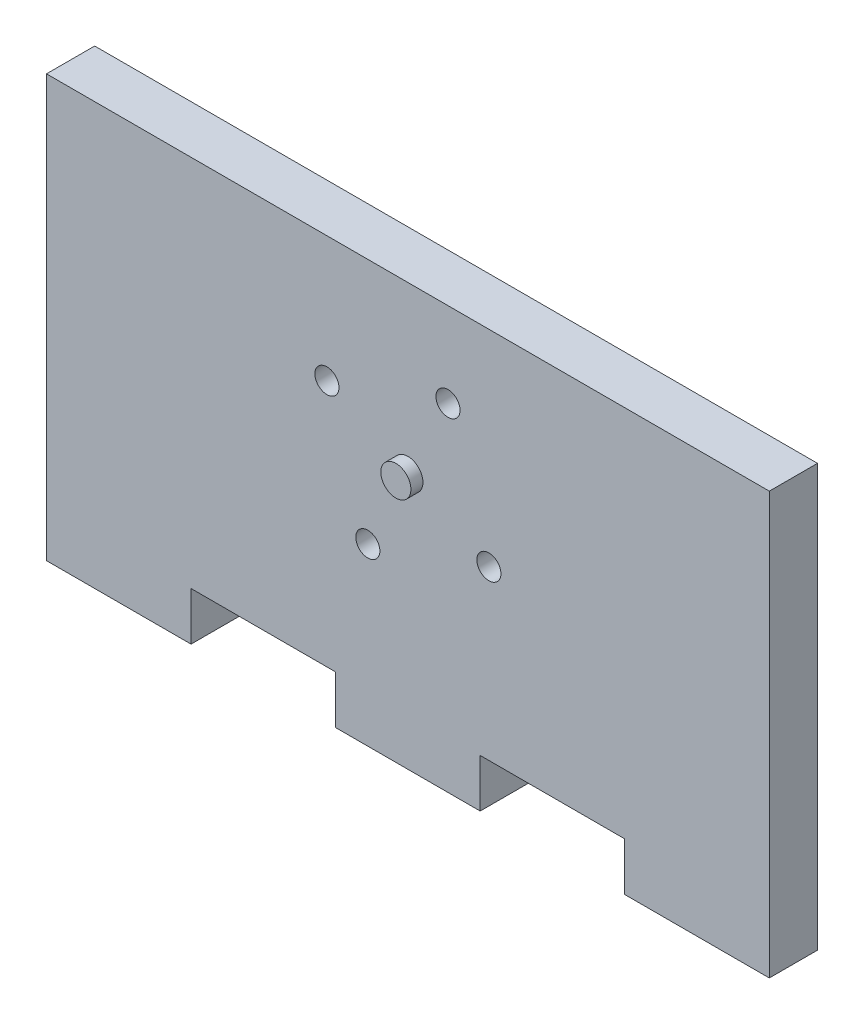
ISO-10303-21;
HEADER;
FILE_DESCRIPTION(('STEP AP214'),'2;1');
FILE_NAME('part.step','',(''),(''),'','','');
FILE_SCHEMA(('AUTOMOTIVE_DESIGN { 1 0 10303 214 1 1 1 1 }'));
ENDSEC;
DATA;
#1=APPLICATION_CONTEXT('core data for automotive mechanical design processes');
#2=APPLICATION_PROTOCOL_DEFINITION('international standard','automotive_design',2000,#1);
#3=PRODUCT_CONTEXT('',#1,'mechanical');
#4=PRODUCT('Part','Part','',(#3));
#5=PRODUCT_RELATED_PRODUCT_CATEGORY('part','',(#4));
#6=PRODUCT_DEFINITION_FORMATION('','',#4);
#7=PRODUCT_DEFINITION_CONTEXT('part definition',#1,'design');
#8=PRODUCT_DEFINITION('design','',#6,#7);
#9=PRODUCT_DEFINITION_SHAPE('','',#8);
#10=(LENGTH_UNIT() NAMED_UNIT(*) SI_UNIT(.MILLI.,.METRE.));
#11=(NAMED_UNIT(*) PLANE_ANGLE_UNIT() SI_UNIT($,.RADIAN.));
#12=(NAMED_UNIT(*) SI_UNIT($,.STERADIAN.) SOLID_ANGLE_UNIT());
#13=UNCERTAINTY_MEASURE_WITH_UNIT(LENGTH_MEASURE(1.E-05),#10,'distance_accuracy_value','');
#14=(GEOMETRIC_REPRESENTATION_CONTEXT(3) GLOBAL_UNCERTAINTY_ASSIGNED_CONTEXT((#13)) GLOBAL_UNIT_ASSIGNED_CONTEXT((#10,
#11,#12)) REPRESENTATION_CONTEXT('',''));
#15=CARTESIAN_POINT('',(0.,0.,0.));
#16=DIRECTION('',(0.,0.,1.));
#17=DIRECTION('',(1.,0.,0.));
#18=AXIS2_PLACEMENT_3D('',#15,#16,#17);
#19=CARTESIAN_POINT('',(38.1,-22.225,5.08));
#20=DIRECTION('',(0.,1.,0.));
#21=DIRECTION('',(-1.,0.,0.));
#22=AXIS2_PLACEMENT_3D('',#19,#20,#21);
#23=PLANE('',#22);
#24=DIRECTION('',(1.,0.,0.));
#25=VECTOR('',#24,1.);
#26=CARTESIAN_POINT('',(38.1,-22.225,0.));
#27=LINE('',#26,#25);
#28=CARTESIAN_POINT('',(-38.1,-22.225,0.));
#29=VERTEX_POINT('',#28);
#30=CARTESIAN_POINT('',(-22.86,-22.225,0.));
#31=VERTEX_POINT('',#30);
#32=EDGE_CURVE('E220',#29,#31,#27,.T.);
#33=ORIENTED_EDGE('',*,*,#32,.T.);
#34=DIRECTION('',(0.,0.,-1.));
#35=VECTOR('',#34,1.);
#36=CARTESIAN_POINT('',(-22.86,-22.225,0.));
#37=LINE('',#36,#35);
#38=CARTESIAN_POINT('',(-22.86,-22.225,5.08));
#39=VERTEX_POINT('',#38);
#40=EDGE_CURVE('E168',#39,#31,#37,.T.);
#41=ORIENTED_EDGE('',*,*,#40,.F.);
#42=DIRECTION('',(1.,0.,0.));
#43=VECTOR('',#42,1.);
#44=CARTESIAN_POINT('',(38.1,-22.225,5.08));
#45=LINE('',#44,#43);
#46=CARTESIAN_POINT('',(-38.1,-22.225,5.08));
#47=VERTEX_POINT('',#46);
#48=EDGE_CURVE('E208',#47,#39,#45,.T.);
#49=ORIENTED_EDGE('',*,*,#48,.F.);
#50=DIRECTION('',(0.,0.,-1.));
#51=VECTOR('',#50,1.);
#52=CARTESIAN_POINT('',(-38.1,-22.225,5.08));
#53=LINE('',#52,#51);
#54=EDGE_CURVE('E37',#47,#29,#53,.T.);
#55=ORIENTED_EDGE('',*,*,#54,.T.);
#56=EDGE_LOOP('',(#33,#41,#49,#55));
#57=FACE_BOUND('',#56,.T.);
#58=ADVANCED_FACE('F33',(#57),#23,.F.);
#59=CARTESIAN_POINT('',(22.86,-22.225,5.08));
#60=VERTEX_POINT('',#59);
#61=CARTESIAN_POINT('',(38.1,-22.225,5.08));
#62=VERTEX_POINT('',#61);
#63=EDGE_CURVE('E206',#60,#62,#45,.T.);
#64=ORIENTED_EDGE('',*,*,#63,.F.);
#65=DIRECTION('',(0.,0.,1.));
#66=VECTOR('',#65,1.);
#67=CARTESIAN_POINT('',(22.86,-22.225,5.08));
#68=LINE('',#67,#66);
#69=CARTESIAN_POINT('',(22.86,-22.225,0.));
#70=VERTEX_POINT('',#69);
#71=EDGE_CURVE('E163',#70,#60,#68,.T.);
#72=ORIENTED_EDGE('',*,*,#71,.F.);
#73=CARTESIAN_POINT('',(38.1,-22.225,0.));
#74=VERTEX_POINT('',#73);
#75=EDGE_CURVE('E219',#70,#74,#27,.T.);
#76=ORIENTED_EDGE('',*,*,#75,.T.);
#77=DIRECTION('',(0.,0.,-1.));
#78=VECTOR('',#77,1.);
#79=CARTESIAN_POINT('',(38.1,-22.225,5.08));
#80=LINE('',#79,#78);
#81=EDGE_CURVE('E230',#62,#74,#80,.T.);
#82=ORIENTED_EDGE('',*,*,#81,.F.);
#83=EDGE_LOOP('',(#64,#72,#76,#82));
#84=FACE_BOUND('',#83,.T.);
#85=ADVANCED_FACE('F274',(#84),#23,.F.);
#86=CARTESIAN_POINT('',(-38.1,-22.225,5.08));
#87=DIRECTION('',(1.,0.,0.));
#88=DIRECTION('',(0.,0.,-1.));
#89=AXIS2_PLACEMENT_3D('',#86,#87,#88);
#90=PLANE('',#89);
#91=DIRECTION('',(0.,-1.,0.));
#92=VECTOR('',#91,1.);
#93=CARTESIAN_POINT('',(-38.1,-22.225,0.));
#94=LINE('',#93,#92);
#95=CARTESIAN_POINT('',(-38.1,22.225,0.));
#96=VERTEX_POINT('',#95);
#97=EDGE_CURVE('E201',#96,#29,#94,.T.);
#98=ORIENTED_EDGE('',*,*,#97,.T.);
#99=ORIENTED_EDGE('',*,*,#54,.F.);
#100=DIRECTION('',(0.,-1.,0.));
#101=VECTOR('',#100,1.);
#102=CARTESIAN_POINT('',(-38.1,-22.225,5.08));
#103=LINE('',#102,#101);
#104=CARTESIAN_POINT('',(-38.1,22.225,5.08));
#105=VERTEX_POINT('',#104);
#106=EDGE_CURVE('E203',#105,#47,#103,.T.);
#107=ORIENTED_EDGE('',*,*,#106,.F.);
#108=DIRECTION('',(0.,0.,-1.));
#109=VECTOR('',#108,1.);
#110=CARTESIAN_POINT('',(-38.1,22.225,5.08));
#111=LINE('',#110,#109);
#112=EDGE_CURVE('E216',#105,#96,#111,.T.);
#113=ORIENTED_EDGE('',*,*,#112,.T.);
#114=EDGE_LOOP('',(#98,#99,#107,#113));
#115=FACE_BOUND('',#114,.T.);
#116=ADVANCED_FACE('F35',(#115),#90,.F.);
#117=CARTESIAN_POINT('',(-7.61999999999998,-22.225,5.08));
#118=VERTEX_POINT('',#117);
#119=CARTESIAN_POINT('',(7.62000000000002,-22.225,5.08));
#120=VERTEX_POINT('',#119);
#121=EDGE_CURVE('E212',#118,#120,#45,.T.);
#122=ORIENTED_EDGE('',*,*,#121,.F.);
#123=DIRECTION('',(0.,0.,1.));
#124=VECTOR('',#123,1.);
#125=CARTESIAN_POINT('',(-7.61999999999998,-22.225,0.));
#126=LINE('',#125,#124);
#127=CARTESIAN_POINT('',(-7.61999999999998,-22.225,0.));
#128=VERTEX_POINT('',#127);
#129=EDGE_CURVE('E248',#128,#118,#126,.T.);
#130=ORIENTED_EDGE('',*,*,#129,.F.);
#131=CARTESIAN_POINT('',(7.62000000000002,-22.225,0.));
#132=VERTEX_POINT('',#131);
#133=EDGE_CURVE('E145',#128,#132,#27,.T.);
#134=ORIENTED_EDGE('',*,*,#133,.T.);
#135=DIRECTION('',(0.,0.,-1.));
#136=VECTOR('',#135,1.);
#137=CARTESIAN_POINT('',(7.62000000000002,-22.225,5.08));
#138=LINE('',#137,#136);
#139=EDGE_CURVE('E157',#120,#132,#138,.T.);
#140=ORIENTED_EDGE('',*,*,#139,.F.);
#141=EDGE_LOOP('',(#122,#130,#134,#140));
#142=FACE_BOUND('',#141,.T.);
#143=ADVANCED_FACE('F269',(#142),#23,.F.);
#144=CARTESIAN_POINT('',(38.1,-22.225,5.08));
#145=DIRECTION('',(-1.,0.,0.));
#146=DIRECTION('',(0.,0.,1.));
#147=AXIS2_PLACEMENT_3D('',#144,#145,#146);
#148=PLANE('',#147);
#149=DIRECTION('',(0.,1.,0.));
#150=VECTOR('',#149,1.);
#151=CARTESIAN_POINT('',(38.1,-22.225,0.));
#152=LINE('',#151,#150);
#153=CARTESIAN_POINT('',(38.1,22.225,0.));
#154=VERTEX_POINT('',#153);
#155=EDGE_CURVE('E223',#74,#154,#152,.T.);
#156=ORIENTED_EDGE('',*,*,#155,.T.);
#157=DIRECTION('',(0.,0.,-1.));
#158=VECTOR('',#157,1.);
#159=CARTESIAN_POINT('',(38.1,22.225,5.08));
#160=LINE('',#159,#158);
#161=CARTESIAN_POINT('',(38.1,22.225,5.08));
#162=VERTEX_POINT('',#161);
#163=EDGE_CURVE('E228',#162,#154,#160,.T.);
#164=ORIENTED_EDGE('',*,*,#163,.F.);
#165=DIRECTION('',(0.,1.,0.));
#166=VECTOR('',#165,1.);
#167=CARTESIAN_POINT('',(38.1,-22.225,5.08));
#168=LINE('',#167,#166);
#169=EDGE_CURVE('E211',#62,#162,#168,.T.);
#170=ORIENTED_EDGE('',*,*,#169,.F.);
#171=ORIENTED_EDGE('',*,*,#81,.T.);
#172=EDGE_LOOP('',(#156,#164,#170,#171));
#173=FACE_BOUND('',#172,.T.);
#174=ADVANCED_FACE('F260',(#173),#148,.F.);
#175=CARTESIAN_POINT('',(38.1,22.225,5.08));
#176=DIRECTION('',(0.,-1.,0.));
#177=DIRECTION('',(1.,0.,0.));
#178=AXIS2_PLACEMENT_3D('',#175,#176,#177);
#179=PLANE('',#178);
#180=DIRECTION('',(-1.,0.,0.));
#181=VECTOR('',#180,1.);
#182=CARTESIAN_POINT('',(38.1,22.225,0.));
#183=LINE('',#182,#181);
#184=EDGE_CURVE('E207',#154,#96,#183,.T.);
#185=ORIENTED_EDGE('',*,*,#184,.T.);
#186=ORIENTED_EDGE('',*,*,#112,.F.);
#187=DIRECTION('',(-1.,0.,0.));
#188=VECTOR('',#187,1.);
#189=CARTESIAN_POINT('',(38.1,22.225,5.08));
#190=LINE('',#189,#188);
#191=EDGE_CURVE('E214',#162,#105,#190,.T.);
#192=ORIENTED_EDGE('',*,*,#191,.F.);
#193=ORIENTED_EDGE('',*,*,#163,.T.);
#194=EDGE_LOOP('',(#185,#186,#192,#193));
#195=FACE_BOUND('',#194,.T.);
#196=ADVANCED_FACE('F259',(#195),#179,.F.);
#197=CARTESIAN_POINT('',(0.,0.,5.08));
#198=DIRECTION('',(0.,0.,1.));
#199=DIRECTION('',(1.,0.,0.));
#200=AXIS2_PLACEMENT_3D('',#197,#198,#199);
#201=PLANE('',#200);
#202=DIRECTION('',(0.,-1.,0.));
#203=VECTOR('',#202,1.);
#204=CARTESIAN_POINT('',(-22.86,-17.145,5.08));
#205=LINE('',#204,#203);
#206=CARTESIAN_POINT('',(-22.86,-17.145,5.08));
#207=VERTEX_POINT('',#206);
#208=EDGE_CURVE('E148',#207,#39,#205,.T.);
#209=ORIENTED_EDGE('',*,*,#208,.F.);
#210=DIRECTION('',(-1.,0.,0.));
#211=VECTOR('',#210,1.);
#212=CARTESIAN_POINT('',(-22.86,-17.145,5.08));
#213=LINE('',#212,#211);
#214=CARTESIAN_POINT('',(-7.61999999999998,-17.145,5.08));
#215=VERTEX_POINT('',#214);
#216=EDGE_CURVE('E132',#215,#207,#213,.T.);
#217=ORIENTED_EDGE('',*,*,#216,.F.);
#218=DIRECTION('',(0.,-1.,0.));
#219=VECTOR('',#218,1.);
#220=CARTESIAN_POINT('',(-7.61999999999998,-17.145,5.08));
#221=LINE('',#220,#219);
#222=EDGE_CURVE('E130',#215,#118,#221,.T.);
#223=ORIENTED_EDGE('',*,*,#222,.T.);
#224=ORIENTED_EDGE('',*,*,#121,.T.);
#225=DIRECTION('',(0.,-1.,0.));
#226=VECTOR('',#225,1.);
#227=CARTESIAN_POINT('',(7.62000000000002,-17.145,5.08));
#228=LINE('',#227,#226);
#229=CARTESIAN_POINT('',(7.62000000000002,-17.145,5.08));
#230=VERTEX_POINT('',#229);
#231=EDGE_CURVE('E171',#230,#120,#228,.T.);
#232=ORIENTED_EDGE('',*,*,#231,.F.);
#233=DIRECTION('',(-1.,0.,0.));
#234=VECTOR('',#233,1.);
#235=CARTESIAN_POINT('',(7.62000000000002,-17.145,5.08));
#236=LINE('',#235,#234);
#237=CARTESIAN_POINT('',(22.86,-17.145,5.08));
#238=VERTEX_POINT('',#237);
#239=EDGE_CURVE('E156',#238,#230,#236,.T.);
#240=ORIENTED_EDGE('',*,*,#239,.F.);
#241=DIRECTION('',(0.,-1.,0.));
#242=VECTOR('',#241,1.);
#243=CARTESIAN_POINT('',(22.86,-17.145,5.08));
#244=LINE('',#243,#242);
#245=EDGE_CURVE('E162',#238,#60,#244,.T.);
#246=ORIENTED_EDGE('',*,*,#245,.T.);
#247=ORIENTED_EDGE('',*,*,#63,.T.);
#248=ORIENTED_EDGE('',*,*,#169,.T.);
#249=ORIENTED_EDGE('',*,*,#191,.T.);
#250=ORIENTED_EDGE('',*,*,#106,.T.);
#251=ORIENTED_EDGE('',*,*,#48,.T.);
#252=EDGE_LOOP('',(#209,#217,#223,#224,#232,#240,#246,#247,#248,#249,#250,#251));
#253=FACE_BOUND('',#252,.T.);
#254=CARTESIAN_POINT('',(-4.22601314755713,-3.7736840348773,5.08));
#255=DIRECTION('',(0.,0.,1.));
#256=DIRECTION('',(1.,0.,0.));
#257=AXIS2_PLACEMENT_3D('',#254,#255,#256);
#258=CIRCLE('',#257,1.26999999992882);
#259=CARTESIAN_POINT('',(-2.95601314762831,-3.7736840348773,5.08));
#260=VERTEX_POINT('',#259);
#261=EDGE_CURVE('E196',#260,#260,#258,.T.);
#262=ORIENTED_EDGE('',*,*,#261,.F.);
#263=EDGE_LOOP('',(#262));
#264=FACE_BOUND('',#263,.T.);
#265=CARTESIAN_POINT('',(8.53618403481198,0.536486852491764,5.08));
#266=DIRECTION('',(0.,0.,1.));
#267=DIRECTION('',(1.,0.,0.));
#268=AXIS2_PLACEMENT_3D('',#265,#266,#267);
#269=CIRCLE('',#268,1.26999999994442);
#270=CARTESIAN_POINT('',(9.8061840347564,0.536486852491764,5.08));
#271=VERTEX_POINT('',#270);
#272=EDGE_CURVE('E193',#271,#271,#269,.T.);
#273=ORIENTED_EDGE('',*,*,#272,.F.);
#274=EDGE_LOOP('',(#273));
#275=FACE_BOUND('',#274,.T.);
#276=CARTESIAN_POINT('',(4.22601314744267,13.2986840348611,5.08));
#277=DIRECTION('',(0.,0.,1.));
#278=DIRECTION('',(1.,0.,0.));
#279=AXIS2_PLACEMENT_3D('',#276,#277,#278);
#280=CIRCLE('',#279,1.26999999996631);
#281=CARTESIAN_POINT('',(5.49601314740899,13.2986840348611,5.08));
#282=VERTEX_POINT('',#281);
#283=EDGE_CURVE('E190',#282,#282,#280,.T.);
#284=ORIENTED_EDGE('',*,*,#283,.F.);
#285=EDGE_LOOP('',(#284));
#286=FACE_BOUND('',#285,.T.);
#287=CARTESIAN_POINT('',(-8.53618403492646,8.98851314749197,5.08));
#288=DIRECTION('',(0.,0.,1.));
#289=DIRECTION('',(1.,0.,0.));
#290=AXIS2_PLACEMENT_3D('',#287,#288,#289);
#291=CIRCLE('',#290,1.26999999995079);
#292=CARTESIAN_POINT('',(-7.26618403497567,8.98851314749197,5.08));
#293=VERTEX_POINT('',#292);
#294=EDGE_CURVE('E178',#293,#293,#291,.T.);
#295=ORIENTED_EDGE('',*,*,#294,.F.);
#296=EDGE_LOOP('',(#295));
#297=FACE_BOUND('',#296,.T.);
#298=CARTESIAN_POINT('',(-5.74262859487362E-11,4.76249999999212,5.08));
#299=DIRECTION('',(0.,0.,1.));
#300=DIRECTION('',(1.,0.,0.));
#301=AXIS2_PLACEMENT_3D('',#298,#299,#300);
#302=CIRCLE('',#301,1.58749999994738);
#303=CARTESIAN_POINT('',(1.58749999988995,4.76249999999212,5.08));
#304=VERTEX_POINT('',#303);
#305=EDGE_CURVE('E11',#304,#304,#302,.T.);
#306=ORIENTED_EDGE('',*,*,#305,.F.);
#307=EDGE_LOOP('',(#306));
#308=FACE_BOUND('',#307,.T.);
#309=ADVANCED_FACE('F254',(#253,#264,#275,#286,#297,#308),#201,.T.);
#310=CARTESIAN_POINT('',(0.,0.,0.));
#311=DIRECTION('',(0.,0.,1.));
#312=DIRECTION('',(1.,0.,0.));
#313=AXIS2_PLACEMENT_3D('',#310,#311,#312);
#314=PLANE('',#313);
#315=DIRECTION('',(1.,0.,0.));
#316=VECTOR('',#315,1.);
#317=CARTESIAN_POINT('',(-22.86,-17.145,0.));
#318=LINE('',#317,#316);
#319=CARTESIAN_POINT('',(-22.86,-17.145,0.));
#320=VERTEX_POINT('',#319);
#321=CARTESIAN_POINT('',(-7.61999999999998,-17.145,0.));
#322=VERTEX_POINT('',#321);
#323=EDGE_CURVE('E133',#320,#322,#318,.T.);
#324=ORIENTED_EDGE('',*,*,#323,.F.);
#325=DIRECTION('',(0.,-1.,0.));
#326=VECTOR('',#325,1.);
#327=CARTESIAN_POINT('',(-22.86,-17.145,0.));
#328=LINE('',#327,#326);
#329=EDGE_CURVE('E146',#320,#31,#328,.T.);
#330=ORIENTED_EDGE('',*,*,#329,.T.);
#331=ORIENTED_EDGE('',*,*,#32,.F.);
#332=ORIENTED_EDGE('',*,*,#97,.F.);
#333=ORIENTED_EDGE('',*,*,#184,.F.);
#334=ORIENTED_EDGE('',*,*,#155,.F.);
#335=ORIENTED_EDGE('',*,*,#75,.F.);
#336=DIRECTION('',(0.,-1.,0.));
#337=VECTOR('',#336,1.);
#338=CARTESIAN_POINT('',(22.86,-17.145,0.));
#339=LINE('',#338,#337);
#340=CARTESIAN_POINT('',(22.86,-17.145,0.));
#341=VERTEX_POINT('',#340);
#342=EDGE_CURVE('E166',#341,#70,#339,.T.);
#343=ORIENTED_EDGE('',*,*,#342,.F.);
#344=DIRECTION('',(1.,0.,0.));
#345=VECTOR('',#344,1.);
#346=CARTESIAN_POINT('',(7.62000000000002,-17.145,0.));
#347=LINE('',#346,#345);
#348=CARTESIAN_POINT('',(7.62000000000002,-17.145,0.));
#349=VERTEX_POINT('',#348);
#350=EDGE_CURVE('E160',#349,#341,#347,.T.);
#351=ORIENTED_EDGE('',*,*,#350,.F.);
#352=DIRECTION('',(0.,-1.,0.));
#353=VECTOR('',#352,1.);
#354=CARTESIAN_POINT('',(7.62000000000002,-17.145,0.));
#355=LINE('',#354,#353);
#356=EDGE_CURVE('E169',#349,#132,#355,.T.);
#357=ORIENTED_EDGE('',*,*,#356,.T.);
#358=ORIENTED_EDGE('',*,*,#133,.F.);
#359=DIRECTION('',(0.,-1.,0.));
#360=VECTOR('',#359,1.);
#361=CARTESIAN_POINT('',(-7.61999999999998,-17.145,0.));
#362=LINE('',#361,#360);
#363=EDGE_CURVE('E127',#322,#128,#362,.T.);
#364=ORIENTED_EDGE('',*,*,#363,.F.);
#365=EDGE_LOOP('',(#324,#330,#331,#332,#333,#334,#335,#343,#351,#357,#358,#364));
#366=FACE_BOUND('',#365,.T.);
#367=CARTESIAN_POINT('',(-4.22601314755713,-3.7736840348773,0.));
#368=DIRECTION('',(0.,0.,-1.));
#369=DIRECTION('',(-1.,0.,0.));
#370=AXIS2_PLACEMENT_3D('',#367,#368,#369);
#371=CIRCLE('',#370,1.26999999992882);
#372=CARTESIAN_POINT('',(-5.49601314748595,-3.7736840348773,0.));
#373=VERTEX_POINT('',#372);
#374=EDGE_CURVE('E175',#373,#373,#371,.T.);
#375=ORIENTED_EDGE('',*,*,#374,.F.);
#376=EDGE_LOOP('',(#375));
#377=FACE_BOUND('',#376,.T.);
#378=CARTESIAN_POINT('',(8.53618403481198,0.536486852491764,0.));
#379=DIRECTION('',(0.,0.,-1.));
#380=DIRECTION('',(-1.,0.,0.));
#381=AXIS2_PLACEMENT_3D('',#378,#379,#380);
#382=CIRCLE('',#381,1.26999999994442);
#383=CARTESIAN_POINT('',(7.26618403486756,0.536486852491764,0.));
#384=VERTEX_POINT('',#383);
#385=EDGE_CURVE('E179',#384,#384,#382,.T.);
#386=ORIENTED_EDGE('',*,*,#385,.F.);
#387=EDGE_LOOP('',(#386));
#388=FACE_BOUND('',#387,.T.);
#389=CARTESIAN_POINT('',(4.22601314744267,13.2986840348611,0.));
#390=DIRECTION('',(0.,0.,-1.));
#391=DIRECTION('',(-1.,0.,0.));
#392=AXIS2_PLACEMENT_3D('',#389,#390,#391);
#393=CIRCLE('',#392,1.26999999996631);
#394=CARTESIAN_POINT('',(2.95601314747636,13.2986840348611,0.));
#395=VERTEX_POINT('',#394);
#396=EDGE_CURVE('E182',#395,#395,#393,.T.);
#397=ORIENTED_EDGE('',*,*,#396,.F.);
#398=EDGE_LOOP('',(#397));
#399=FACE_BOUND('',#398,.T.);
#400=CARTESIAN_POINT('',(-8.53618403492646,8.98851314749197,0.));
#401=DIRECTION('',(0.,0.,-1.));
#402=DIRECTION('',(-1.,0.,0.));
#403=AXIS2_PLACEMENT_3D('',#400,#401,#402);
#404=CIRCLE('',#403,1.26999999995079);
#405=CARTESIAN_POINT('',(-9.80618403487725,8.98851314749197,0.));
#406=VERTEX_POINT('',#405);
#407=EDGE_CURVE('E185',#406,#406,#404,.T.);
#408=ORIENTED_EDGE('',*,*,#407,.F.);
#409=EDGE_LOOP('',(#408));
#410=FACE_BOUND('',#409,.T.);
#411=ADVANCED_FACE('F141',(#366,#377,#388,#399,#410),#314,.F.);
#412=CARTESIAN_POINT('',(-5.74262859487362E-11,4.76249999999212,6.35));
#413=DIRECTION('',(0.,0.,-1.));
#414=DIRECTION('',(-1.,0.,0.));
#415=AXIS2_PLACEMENT_3D('',#412,#413,#414);
#416=CYLINDRICAL_SURFACE('',#415,1.58749999994738);
#417=ORIENTED_EDGE('',*,*,#305,.T.);
#418=EDGE_LOOP('',(#417));
#419=FACE_BOUND('',#418,.T.);
#420=CARTESIAN_POINT('',(-5.74262859487362E-11,4.76249999999212,6.35));
#421=DIRECTION('',(0.,0.,-1.));
#422=DIRECTION('',(-1.,0.,0.));
#423=AXIS2_PLACEMENT_3D('',#420,#421,#422);
#424=CIRCLE('',#423,1.58749999994738);
#425=CARTESIAN_POINT('',(-1.5875000000048,4.76249999999212,6.35));
#426=VERTEX_POINT('',#425);
#427=EDGE_CURVE('E199',#426,#426,#424,.T.);
#428=ORIENTED_EDGE('',*,*,#427,.T.);
#429=EDGE_LOOP('',(#428));
#430=FACE_BOUND('',#429,.T.);
#431=ADVANCED_FACE('F292',(#419,#430),#416,.T.);
#432=CARTESIAN_POINT('',(-5.74262859487362E-11,4.76249999999212,6.35));
#433=DIRECTION('',(0.,0.,-1.));
#434=DIRECTION('',(-1.,0.,0.));
#435=AXIS2_PLACEMENT_3D('',#432,#433,#434);
#436=PLANE('',#435);
#437=ORIENTED_EDGE('',*,*,#427,.F.);
#438=EDGE_LOOP('',(#437));
#439=FACE_BOUND('',#438,.T.);
#440=ADVANCED_FACE('F297',(#439),#436,.F.);
#441=CARTESIAN_POINT('',(-8.53618403492646,8.98851314749197,6.35));
#442=DIRECTION('',(0.,0.,-1.));
#443=DIRECTION('',(-1.,0.,0.));
#444=AXIS2_PLACEMENT_3D('',#441,#442,#443);
#445=CYLINDRICAL_SURFACE('',#444,1.26999999995079);
#446=ORIENTED_EDGE('',*,*,#294,.T.);
#447=EDGE_LOOP('',(#446));
#448=FACE_BOUND('',#447,.T.);
#449=ORIENTED_EDGE('',*,*,#407,.T.);
#450=EDGE_LOOP('',(#449));
#451=FACE_BOUND('',#450,.T.);
#452=ADVANCED_FACE('F301',(#448,#451),#445,.F.);
#453=CARTESIAN_POINT('',(4.22601314744267,13.2986840348611,6.35));
#454=DIRECTION('',(0.,0.,-1.));
#455=DIRECTION('',(-1.,0.,0.));
#456=AXIS2_PLACEMENT_3D('',#453,#454,#455);
#457=CYLINDRICAL_SURFACE('',#456,1.26999999996631);
#458=ORIENTED_EDGE('',*,*,#283,.T.);
#459=EDGE_LOOP('',(#458));
#460=FACE_BOUND('',#459,.T.);
#461=ORIENTED_EDGE('',*,*,#396,.T.);
#462=EDGE_LOOP('',(#461));
#463=FACE_BOUND('',#462,.T.);
#464=ADVANCED_FACE('F305',(#460,#463),#457,.F.);
#465=CARTESIAN_POINT('',(8.53618403481198,0.536486852491764,6.35));
#466=DIRECTION('',(0.,0.,-1.));
#467=DIRECTION('',(-1.,0.,0.));
#468=AXIS2_PLACEMENT_3D('',#465,#466,#467);
#469=CYLINDRICAL_SURFACE('',#468,1.26999999994442);
#470=ORIENTED_EDGE('',*,*,#272,.T.);
#471=EDGE_LOOP('',(#470));
#472=FACE_BOUND('',#471,.T.);
#473=ORIENTED_EDGE('',*,*,#385,.T.);
#474=EDGE_LOOP('',(#473));
#475=FACE_BOUND('',#474,.T.);
#476=ADVANCED_FACE('F309',(#472,#475),#469,.F.);
#477=CARTESIAN_POINT('',(-4.22601314755713,-3.7736840348773,6.35));
#478=DIRECTION('',(0.,0.,-1.));
#479=DIRECTION('',(-1.,0.,0.));
#480=AXIS2_PLACEMENT_3D('',#477,#478,#479);
#481=CYLINDRICAL_SURFACE('',#480,1.26999999992882);
#482=ORIENTED_EDGE('',*,*,#261,.T.);
#483=EDGE_LOOP('',(#482));
#484=FACE_BOUND('',#483,.T.);
#485=ORIENTED_EDGE('',*,*,#374,.T.);
#486=EDGE_LOOP('',(#485));
#487=FACE_BOUND('',#486,.T.);
#488=ADVANCED_FACE('F313',(#484,#487),#481,.F.);
#489=CARTESIAN_POINT('',(22.86,-17.145,5.08));
#490=DIRECTION('',(1.,0.,0.));
#491=DIRECTION('',(0.,0.,-1.));
#492=AXIS2_PLACEMENT_3D('',#489,#490,#491);
#493=PLANE('',#492);
#494=ORIENTED_EDGE('',*,*,#71,.T.);
#495=ORIENTED_EDGE('',*,*,#245,.F.);
#496=DIRECTION('',(0.,0.,1.));
#497=VECTOR('',#496,1.);
#498=CARTESIAN_POINT('',(22.86,-17.145,5.08));
#499=LINE('',#498,#497);
#500=EDGE_CURVE('E153',#341,#238,#499,.T.);
#501=ORIENTED_EDGE('',*,*,#500,.F.);
#502=ORIENTED_EDGE('',*,*,#342,.T.);
#503=EDGE_LOOP('',(#494,#495,#501,#502));
#504=FACE_BOUND('',#503,.T.);
#505=ADVANCED_FACE('F317',(#504),#493,.F.);
#506=CARTESIAN_POINT('',(7.62000000000002,-17.145,5.08));
#507=DIRECTION('',(-1.,0.,0.));
#508=DIRECTION('',(0.,-1.,0.));
#509=AXIS2_PLACEMENT_3D('',#506,#507,#508);
#510=PLANE('',#509);
#511=ORIENTED_EDGE('',*,*,#139,.T.);
#512=ORIENTED_EDGE('',*,*,#356,.F.);
#513=DIRECTION('',(0.,0.,-1.));
#514=VECTOR('',#513,1.);
#515=CARTESIAN_POINT('',(7.62000000000002,-17.145,5.08));
#516=LINE('',#515,#514);
#517=EDGE_CURVE('E57',#230,#349,#516,.T.);
#518=ORIENTED_EDGE('',*,*,#517,.F.);
#519=ORIENTED_EDGE('',*,*,#231,.T.);
#520=EDGE_LOOP('',(#511,#512,#518,#519));
#521=FACE_BOUND('',#520,.T.);
#522=ADVANCED_FACE('F321',(#521),#510,.F.);
#523=CARTESIAN_POINT('',(0.,-17.145,0.));
#524=DIRECTION('',(0.,-1.,0.));
#525=DIRECTION('',(1.,0.,0.));
#526=AXIS2_PLACEMENT_3D('',#523,#524,#525);
#527=PLANE('',#526);
#528=ORIENTED_EDGE('',*,*,#500,.T.);
#529=ORIENTED_EDGE('',*,*,#239,.T.);
#530=ORIENTED_EDGE('',*,*,#517,.T.);
#531=ORIENTED_EDGE('',*,*,#350,.T.);
#532=EDGE_LOOP('',(#528,#529,#530,#531));
#533=FACE_BOUND('',#532,.T.);
#534=ADVANCED_FACE('F325',(#533),#527,.T.);
#535=CARTESIAN_POINT('',(-22.86,-17.145,0.));
#536=DIRECTION('',(-1.,0.,0.));
#537=DIRECTION('',(0.,-1.,0.));
#538=AXIS2_PLACEMENT_3D('',#535,#536,#537);
#539=PLANE('',#538);
#540=ORIENTED_EDGE('',*,*,#40,.T.);
#541=ORIENTED_EDGE('',*,*,#329,.F.);
#542=DIRECTION('',(0.,0.,-1.));
#543=VECTOR('',#542,1.);
#544=CARTESIAN_POINT('',(-22.86,-17.145,0.));
#545=LINE('',#544,#543);
#546=EDGE_CURVE('E49',#207,#320,#545,.T.);
#547=ORIENTED_EDGE('',*,*,#546,.F.);
#548=ORIENTED_EDGE('',*,*,#208,.T.);
#549=EDGE_LOOP('',(#540,#541,#547,#548));
#550=FACE_BOUND('',#549,.T.);
#551=ADVANCED_FACE('F246',(#550),#539,.F.);
#552=CARTESIAN_POINT('',(-7.61999999999998,-17.145,0.));
#553=DIRECTION('',(1.,0.,0.));
#554=DIRECTION('',(0.,1.,0.));
#555=AXIS2_PLACEMENT_3D('',#552,#553,#554);
#556=PLANE('',#555);
#557=ORIENTED_EDGE('',*,*,#129,.T.);
#558=ORIENTED_EDGE('',*,*,#222,.F.);
#559=DIRECTION('',(0.,0.,1.));
#560=VECTOR('',#559,1.);
#561=CARTESIAN_POINT('',(-7.61999999999998,-17.145,0.));
#562=LINE('',#561,#560);
#563=EDGE_CURVE('E124',#322,#215,#562,.T.);
#564=ORIENTED_EDGE('',*,*,#563,.F.);
#565=ORIENTED_EDGE('',*,*,#363,.T.);
#566=EDGE_LOOP('',(#557,#558,#564,#565));
#567=FACE_BOUND('',#566,.T.);
#568=ADVANCED_FACE('F125',(#567),#556,.F.);
#569=CARTESIAN_POINT('',(0.,-17.145,0.));
#570=DIRECTION('',(0.,1.,0.));
#571=DIRECTION('',(-1.,0.,0.));
#572=AXIS2_PLACEMENT_3D('',#569,#570,#571);
#573=PLANE('',#572);
#574=ORIENTED_EDGE('',*,*,#546,.T.);
#575=ORIENTED_EDGE('',*,*,#323,.T.);
#576=ORIENTED_EDGE('',*,*,#563,.T.);
#577=ORIENTED_EDGE('',*,*,#216,.T.);
#578=EDGE_LOOP('',(#574,#575,#576,#577));
#579=FACE_BOUND('',#578,.T.);
#580=ADVANCED_FACE('F136',(#579),#573,.F.);
#581=CLOSED_SHELL('',(#58,#85,#116,#143,#174,#196,#309,#411,#431,#440,#452,#464,#476,#488,#505,
#522,#534,#551,#568,#580));
#582=MANIFOLD_SOLID_BREP('B2',#581);
#583=ADVANCED_BREP_SHAPE_REPRESENTATION('',(#18,#582),#14);
#584=SHAPE_DEFINITION_REPRESENTATION(#9,#583);
ENDSEC;
END-ISO-10303-21;
